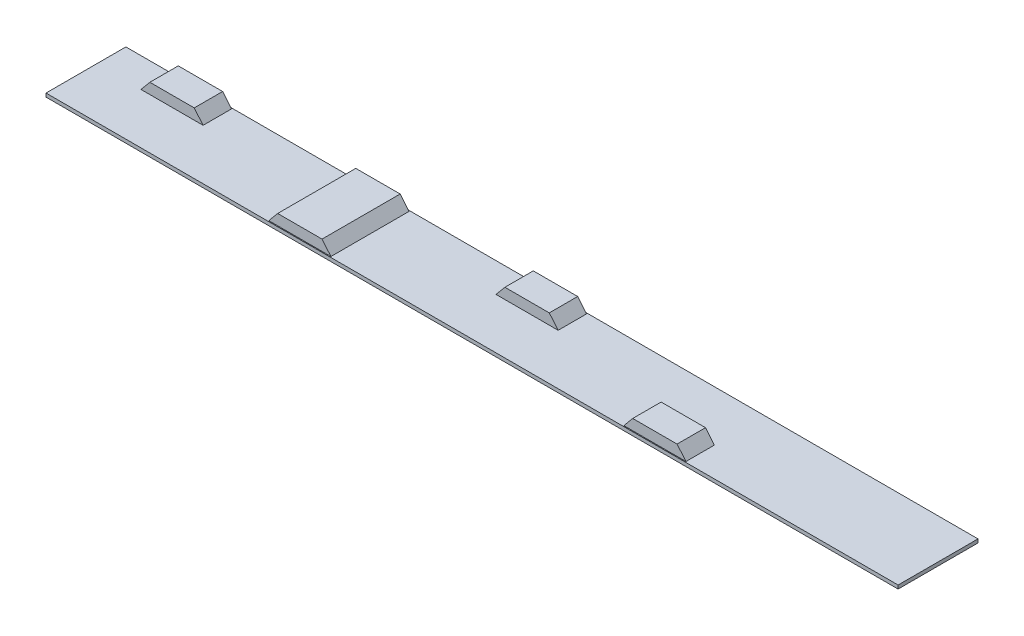
ISO-10303-21;
HEADER;
FILE_DESCRIPTION(('STEP AP214'),'2;1');
FILE_NAME('part.step','',(''),(''),'','','');
FILE_SCHEMA(('AUTOMOTIVE_DESIGN { 1 0 10303 214 1 1 1 1 }'));
ENDSEC;
DATA;
#1=APPLICATION_CONTEXT('core data for automotive mechanical design processes');
#2=APPLICATION_PROTOCOL_DEFINITION('international standard','automotive_design',2000,#1);
#3=PRODUCT_CONTEXT('',#1,'mechanical');
#4=PRODUCT('Part','Part','',(#3));
#5=PRODUCT_RELATED_PRODUCT_CATEGORY('part','',(#4));
#6=PRODUCT_DEFINITION_FORMATION('','',#4);
#7=PRODUCT_DEFINITION_CONTEXT('part definition',#1,'design');
#8=PRODUCT_DEFINITION('design','',#6,#7);
#9=PRODUCT_DEFINITION_SHAPE('','',#8);
#10=(LENGTH_UNIT() NAMED_UNIT(*) SI_UNIT(.MILLI.,.METRE.));
#11=(NAMED_UNIT(*) PLANE_ANGLE_UNIT() SI_UNIT($,.RADIAN.));
#12=(NAMED_UNIT(*) SI_UNIT($,.STERADIAN.) SOLID_ANGLE_UNIT());
#13=UNCERTAINTY_MEASURE_WITH_UNIT(LENGTH_MEASURE(1.E-05),#10,'distance_accuracy_value','');
#14=(GEOMETRIC_REPRESENTATION_CONTEXT(3) GLOBAL_UNCERTAINTY_ASSIGNED_CONTEXT((#13)) GLOBAL_UNIT_ASSIGNED_CONTEXT((#10,
#11,#12)) REPRESENTATION_CONTEXT('',''));
#15=CARTESIAN_POINT('',(0.,0.,0.));
#16=DIRECTION('',(0.,0.,1.));
#17=DIRECTION('',(1.,0.,0.));
#18=AXIS2_PLACEMENT_3D('',#15,#16,#17);
#19=CARTESIAN_POINT('',(0.,10.,0.));
#20=DIRECTION('',(0.,1.,0.));
#21=DIRECTION('',(0.,0.,1.));
#22=AXIS2_PLACEMENT_3D('',#19,#20,#21);
#23=PLANE('',#22);
#24=DIRECTION('',(0.,0.,1.));
#25=VECTOR('',#24,1.);
#26=CARTESIAN_POINT('',(-1200.,10.,112.5));
#27=LINE('',#26,#25);
#28=CARTESIAN_POINT('',(-1200.,10.,-112.5));
#29=VERTEX_POINT('',#28);
#30=CARTESIAN_POINT('',(-1200.,10.,112.5));
#31=VERTEX_POINT('',#30);
#32=EDGE_CURVE('E301',#29,#31,#27,.T.);
#33=ORIENTED_EDGE('',*,*,#32,.T.);
#34=DIRECTION('',(1.,0.,0.));
#35=VECTOR('',#34,1.);
#36=CARTESIAN_POINT('',(1200.,10.,112.5));
#37=LINE('',#36,#35);
#38=CARTESIAN_POINT('',(1200.,10.,112.5));
#39=VERTEX_POINT('',#38);
#40=EDGE_CURVE('E304',#31,#39,#37,.T.);
#41=ORIENTED_EDGE('',*,*,#40,.T.);
#42=DIRECTION('',(0.,0.,-1.));
#43=VECTOR('',#42,1.);
#44=CARTESIAN_POINT('',(1200.,10.,112.5));
#45=LINE('',#44,#43);
#46=CARTESIAN_POINT('',(1200.,10.,-112.5));
#47=VERTEX_POINT('',#46);
#48=EDGE_CURVE('E307',#39,#47,#45,.T.);
#49=ORIENTED_EDGE('',*,*,#48,.T.);
#50=DIRECTION('',(-1.,0.,0.));
#51=VECTOR('',#50,1.);
#52=CARTESIAN_POINT('',(1200.,10.,-112.5));
#53=LINE('',#52,#51);
#54=EDGE_CURVE('E309',#47,#29,#53,.T.);
#55=ORIENTED_EDGE('',*,*,#54,.T.);
#56=EDGE_LOOP('',(#33,#41,#49,#55));
#57=FACE_BOUND('',#56,.T.);
#58=DIRECTION('',(0.,0.,-1.));
#59=VECTOR('',#58,1.);
#60=CARTESIAN_POINT('',(600.,10.,110.));
#61=LINE('',#60,#59);
#62=CARTESIAN_POINT('',(600.,10.,110.));
#63=VERTEX_POINT('',#62);
#64=CARTESIAN_POINT('',(600.,10.,30.));
#65=VERTEX_POINT('',#64);
#66=EDGE_CURVE('E297',#63,#65,#61,.T.);
#67=ORIENTED_EDGE('',*,*,#66,.F.);
#68=DIRECTION('',(1.,0.,0.));
#69=VECTOR('',#68,1.);
#70=CARTESIAN_POINT('',(600.,10.,110.));
#71=LINE('',#70,#69);
#72=CARTESIAN_POINT('',(425.,10.,110.));
#73=VERTEX_POINT('',#72);
#74=EDGE_CURVE('E271',#73,#63,#71,.T.);
#75=ORIENTED_EDGE('',*,*,#74,.F.);
#76=DIRECTION('',(0.,0.,-1.));
#77=VECTOR('',#76,1.);
#78=CARTESIAN_POINT('',(425.,10.,110.));
#79=LINE('',#78,#77);
#80=CARTESIAN_POINT('',(425.,10.,30.));
#81=VERTEX_POINT('',#80);
#82=EDGE_CURVE('E282',#73,#81,#79,.T.);
#83=ORIENTED_EDGE('',*,*,#82,.T.);
#84=DIRECTION('',(1.,0.,0.));
#85=VECTOR('',#84,1.);
#86=CARTESIAN_POINT('',(600.,10.,30.));
#87=LINE('',#86,#85);
#88=EDGE_CURVE('E265',#81,#65,#87,.T.);
#89=ORIENTED_EDGE('',*,*,#88,.T.);
#90=EDGE_LOOP('',(#67,#75,#83,#89));
#91=FACE_BOUND('',#90,.T.);
#92=DIRECTION('',(0.,0.,1.));
#93=VECTOR('',#92,1.);
#94=CARTESIAN_POINT('',(-75.0000000000001,9.99999999999651,-110.));
#95=LINE('',#94,#93);
#96=CARTESIAN_POINT('',(-74.9999999999972,10.,-110.));
#97=VERTEX_POINT('',#96);
#98=CARTESIAN_POINT('',(-75.0000000000001,10.,-30.));
#99=VERTEX_POINT('',#98);
#100=EDGE_CURVE('E262',#97,#99,#95,.T.);
#101=ORIENTED_EDGE('',*,*,#100,.F.);
#102=DIRECTION('',(1.,0.,0.));
#103=VECTOR('',#102,1.);
#104=CARTESIAN_POINT('',(-75.0000000000001,9.99999999999651,-110.));
#105=LINE('',#104,#103);
#106=CARTESIAN_POINT('',(99.999999999997,10.,-110.));
#107=VERTEX_POINT('',#106);
#108=EDGE_CURVE('E239',#97,#107,#105,.T.);
#109=ORIENTED_EDGE('',*,*,#108,.T.);
#110=DIRECTION('',(0.,0.,1.));
#111=VECTOR('',#110,1.);
#112=CARTESIAN_POINT('',(99.9999999999999,9.99999999999651,-110.));
#113=LINE('',#112,#111);
#114=CARTESIAN_POINT('',(99.9999999999999,9.99999999999651,-30.));
#115=VERTEX_POINT('',#114);
#116=EDGE_CURVE('E251',#107,#115,#113,.T.);
#117=ORIENTED_EDGE('',*,*,#116,.T.);
#118=DIRECTION('',(1.,0.,0.));
#119=VECTOR('',#118,1.);
#120=CARTESIAN_POINT('',(-75.0000000000001,9.99999999999651,-30.));
#121=LINE('',#120,#119);
#122=EDGE_CURVE('E233',#99,#115,#121,.T.);
#123=ORIENTED_EDGE('',*,*,#122,.F.);
#124=EDGE_LOOP('',(#101,#109,#117,#123));
#125=FACE_BOUND('',#124,.T.);
#126=DIRECTION('',(0.,0.,1.));
#127=VECTOR('',#126,1.);
#128=CARTESIAN_POINT('',(-575.,9.99999999999302,-110.));
#129=LINE('',#128,#127);
#130=CARTESIAN_POINT('',(-574.999999999994,10.,-110.));
#131=VERTEX_POINT('',#130);
#132=CARTESIAN_POINT('',(-575.,10.,110.));
#133=VERTEX_POINT('',#132);
#134=EDGE_CURVE('E230',#131,#133,#129,.T.);
#135=ORIENTED_EDGE('',*,*,#134,.F.);
#136=DIRECTION('',(1.,0.,0.));
#137=VECTOR('',#136,1.);
#138=CARTESIAN_POINT('',(-575.,9.99999999999302,-110.));
#139=LINE('',#138,#137);
#140=CARTESIAN_POINT('',(-400.000000000006,10.,-110.));
#141=VERTEX_POINT('',#140);
#142=EDGE_CURVE('E218',#131,#141,#139,.T.);
#143=ORIENTED_EDGE('',*,*,#142,.T.);
#144=DIRECTION('',(0.,0.,1.));
#145=VECTOR('',#144,1.);
#146=CARTESIAN_POINT('',(-400.,9.99999999999302,-110.));
#147=LINE('',#146,#145);
#148=CARTESIAN_POINT('',(-400.,9.99999999999302,110.));
#149=VERTEX_POINT('',#148);
#150=EDGE_CURVE('E229',#141,#149,#147,.T.);
#151=ORIENTED_EDGE('',*,*,#150,.T.);
#152=DIRECTION('',(1.,0.,0.));
#153=VECTOR('',#152,1.);
#154=CARTESIAN_POINT('',(-575.,9.99999999999302,110.));
#155=LINE('',#154,#153);
#156=EDGE_CURVE('E203',#133,#149,#155,.T.);
#157=ORIENTED_EDGE('',*,*,#156,.F.);
#158=EDGE_LOOP('',(#135,#143,#151,#157));
#159=FACE_BOUND('',#158,.T.);
#160=DIRECTION('',(0.,0.,1.));
#161=VECTOR('',#160,1.);
#162=CARTESIAN_POINT('',(-1075.,9.99999999998953,-110.));
#163=LINE('',#162,#161);
#164=CARTESIAN_POINT('',(-1074.99999999999,10.,-110.));
#165=VERTEX_POINT('',#164);
#166=CARTESIAN_POINT('',(-1074.99999999999,9.99999999999998,-30.));
#167=VERTEX_POINT('',#166);
#168=EDGE_CURVE('E53',#165,#167,#163,.T.);
#169=ORIENTED_EDGE('',*,*,#168,.F.);
#170=DIRECTION('',(1.,0.,0.));
#171=VECTOR('',#170,1.);
#172=CARTESIAN_POINT('',(-1075.,9.99999999998953,-110.));
#173=LINE('',#172,#171);
#174=CARTESIAN_POINT('',(-900.000000000009,10.,-110.));
#175=VERTEX_POINT('',#174);
#176=EDGE_CURVE('E48',#165,#175,#173,.T.);
#177=ORIENTED_EDGE('',*,*,#176,.T.);
#178=DIRECTION('',(0.,0.,1.));
#179=VECTOR('',#178,1.);
#180=CARTESIAN_POINT('',(-900.,9.99999999998952,-110.));
#181=LINE('',#180,#179);
#182=CARTESIAN_POINT('',(-900.,9.99999999998952,-30.));
#183=VERTEX_POINT('',#182);
#184=EDGE_CURVE('E204',#175,#183,#181,.T.);
#185=ORIENTED_EDGE('',*,*,#184,.T.);
#186=DIRECTION('',(1.,0.,0.));
#187=VECTOR('',#186,1.);
#188=CARTESIAN_POINT('',(-1075.,9.99999999998953,-30.));
#189=LINE('',#188,#187);
#190=EDGE_CURVE('E192',#167,#183,#189,.T.);
#191=ORIENTED_EDGE('',*,*,#190,.F.);
#192=EDGE_LOOP('',(#169,#177,#185,#191));
#193=FACE_BOUND('',#192,.T.);
#194=ADVANCED_FACE('F33',(#57,#91,#125,#159,#193),#23,.T.);
#195=CARTESIAN_POINT('',(-1200.,10.,112.5));
#196=DIRECTION('',(1.,0.,0.));
#197=DIRECTION('',(0.,0.,-1.));
#198=AXIS2_PLACEMENT_3D('',#195,#196,#197);
#199=PLANE('',#198);
#200=DIRECTION('',(0.,0.,1.));
#201=VECTOR('',#200,1.);
#202=CARTESIAN_POINT('',(-1200.,0.,112.5));
#203=LINE('',#202,#201);
#204=CARTESIAN_POINT('',(-1200.,0.,-112.5));
#205=VERTEX_POINT('',#204);
#206=CARTESIAN_POINT('',(-1200.,0.,112.5));
#207=VERTEX_POINT('',#206);
#208=EDGE_CURVE('E300',#205,#207,#203,.T.);
#209=ORIENTED_EDGE('',*,*,#208,.T.);
#210=DIRECTION('',(0.,-1.,0.));
#211=VECTOR('',#210,1.);
#212=CARTESIAN_POINT('',(-1200.,10.,112.5));
#213=LINE('',#212,#211);
#214=EDGE_CURVE('E11',#31,#207,#213,.T.);
#215=ORIENTED_EDGE('',*,*,#214,.F.);
#216=ORIENTED_EDGE('',*,*,#32,.F.);
#217=DIRECTION('',(0.,-1.,0.));
#218=VECTOR('',#217,1.);
#219=CARTESIAN_POINT('',(-1200.,10.,-112.5));
#220=LINE('',#219,#218);
#221=EDGE_CURVE('E311',#29,#205,#220,.T.);
#222=ORIENTED_EDGE('',*,*,#221,.T.);
#223=EDGE_LOOP('',(#209,#215,#216,#222));
#224=FACE_BOUND('',#223,.T.);
#225=ADVANCED_FACE('F35',(#224),#199,.F.);
#226=CARTESIAN_POINT('',(1200.,10.,112.5));
#227=DIRECTION('',(0.,0.,-1.));
#228=DIRECTION('',(-1.,0.,0.));
#229=AXIS2_PLACEMENT_3D('',#226,#227,#228);
#230=PLANE('',#229);
#231=DIRECTION('',(1.,0.,0.));
#232=VECTOR('',#231,1.);
#233=CARTESIAN_POINT('',(1200.,0.,112.5));
#234=LINE('',#233,#232);
#235=CARTESIAN_POINT('',(1200.,0.,112.5));
#236=VERTEX_POINT('',#235);
#237=EDGE_CURVE('E314',#207,#236,#234,.T.);
#238=ORIENTED_EDGE('',*,*,#237,.T.);
#239=DIRECTION('',(0.,-1.,0.));
#240=VECTOR('',#239,1.);
#241=CARTESIAN_POINT('',(1200.,10.,112.5));
#242=LINE('',#241,#240);
#243=EDGE_CURVE('E41',#39,#236,#242,.T.);
#244=ORIENTED_EDGE('',*,*,#243,.F.);
#245=ORIENTED_EDGE('',*,*,#40,.F.);
#246=ORIENTED_EDGE('',*,*,#214,.T.);
#247=EDGE_LOOP('',(#238,#244,#245,#246));
#248=FACE_BOUND('',#247,.T.);
#249=ADVANCED_FACE('F344',(#248),#230,.F.);
#250=CARTESIAN_POINT('',(1200.,10.,112.5));
#251=DIRECTION('',(-1.,0.,0.));
#252=DIRECTION('',(0.,0.,1.));
#253=AXIS2_PLACEMENT_3D('',#250,#251,#252);
#254=PLANE('',#253);
#255=DIRECTION('',(0.,0.,-1.));
#256=VECTOR('',#255,1.);
#257=CARTESIAN_POINT('',(1200.,0.,112.5));
#258=LINE('',#257,#256);
#259=CARTESIAN_POINT('',(1200.,0.,-112.5));
#260=VERTEX_POINT('',#259);
#261=EDGE_CURVE('E316',#236,#260,#258,.T.);
#262=ORIENTED_EDGE('',*,*,#261,.T.);
#263=DIRECTION('',(0.,-1.,0.));
#264=VECTOR('',#263,1.);
#265=CARTESIAN_POINT('',(1200.,10.,-112.5));
#266=LINE('',#265,#264);
#267=EDGE_CURVE('E321',#47,#260,#266,.T.);
#268=ORIENTED_EDGE('',*,*,#267,.F.);
#269=ORIENTED_EDGE('',*,*,#48,.F.);
#270=ORIENTED_EDGE('',*,*,#243,.T.);
#271=EDGE_LOOP('',(#262,#268,#269,#270));
#272=FACE_BOUND('',#271,.T.);
#273=ADVANCED_FACE('F328',(#272),#254,.F.);
#274=CARTESIAN_POINT('',(1200.,10.,-112.5));
#275=DIRECTION('',(0.,0.,1.));
#276=DIRECTION('',(1.,0.,0.));
#277=AXIS2_PLACEMENT_3D('',#274,#275,#276);
#278=PLANE('',#277);
#279=DIRECTION('',(-1.,0.,0.));
#280=VECTOR('',#279,1.);
#281=CARTESIAN_POINT('',(1200.,0.,-112.5));
#282=LINE('',#281,#280);
#283=EDGE_CURVE('E305',#260,#205,#282,.T.);
#284=ORIENTED_EDGE('',*,*,#283,.T.);
#285=ORIENTED_EDGE('',*,*,#221,.F.);
#286=ORIENTED_EDGE('',*,*,#54,.F.);
#287=ORIENTED_EDGE('',*,*,#267,.T.);
#288=EDGE_LOOP('',(#284,#285,#286,#287));
#289=FACE_BOUND('',#288,.T.);
#290=ADVANCED_FACE('F337',(#289),#278,.F.);
#291=CARTESIAN_POINT('',(0.,0.,0.));
#292=DIRECTION('',(0.,1.,0.));
#293=DIRECTION('',(0.,0.,1.));
#294=AXIS2_PLACEMENT_3D('',#291,#292,#293);
#295=PLANE('',#294);
#296=ORIENTED_EDGE('',*,*,#208,.F.);
#297=ORIENTED_EDGE('',*,*,#283,.F.);
#298=ORIENTED_EDGE('',*,*,#261,.F.);
#299=ORIENTED_EDGE('',*,*,#237,.F.);
#300=EDGE_LOOP('',(#296,#297,#298,#299));
#301=FACE_BOUND('',#300,.T.);
#302=ADVANCED_FACE('F334',(#301),#295,.F.);
#303=CARTESIAN_POINT('',(575.,40.,110.));
#304=DIRECTION('',(-0.768221279597376,-0.64018439966448,0.));
#305=DIRECTION('',(0.64018439966448,-0.768221279597376,0.));
#306=AXIS2_PLACEMENT_3D('',#303,#304,#305);
#307=PLANE('',#306);
#308=DIRECTION('',(-0.64018439966448,0.768221279597376,0.));
#309=VECTOR('',#308,1.);
#310=CARTESIAN_POINT('',(575.,40.,30.));
#311=LINE('',#310,#309);
#312=CARTESIAN_POINT('',(575.,40.,30.));
#313=VERTEX_POINT('',#312);
#314=EDGE_CURVE('E284',#65,#313,#311,.T.);
#315=ORIENTED_EDGE('',*,*,#314,.T.);
#316=DIRECTION('',(0.,0.,-1.));
#317=VECTOR('',#316,1.);
#318=CARTESIAN_POINT('',(575.,40.,110.));
#319=LINE('',#318,#317);
#320=CARTESIAN_POINT('',(575.,40.,110.));
#321=VERTEX_POINT('',#320);
#322=EDGE_CURVE('E294',#321,#313,#319,.T.);
#323=ORIENTED_EDGE('',*,*,#322,.F.);
#324=DIRECTION('',(-0.64018439966448,0.768221279597376,0.));
#325=VECTOR('',#324,1.);
#326=CARTESIAN_POINT('',(575.,40.,110.));
#327=LINE('',#326,#325);
#328=EDGE_CURVE('E274',#63,#321,#327,.T.);
#329=ORIENTED_EDGE('',*,*,#328,.F.);
#330=ORIENTED_EDGE('',*,*,#66,.T.);
#331=EDGE_LOOP('',(#315,#323,#329,#330));
#332=FACE_BOUND('',#331,.T.);
#333=ADVANCED_FACE('F357',(#332),#307,.F.);
#334=CARTESIAN_POINT('',(450.,40.,110.));
#335=DIRECTION('',(0.,-1.,0.));
#336=DIRECTION('',(1.,0.,0.));
#337=AXIS2_PLACEMENT_3D('',#334,#335,#336);
#338=PLANE('',#337);
#339=DIRECTION('',(-1.,0.,0.));
#340=VECTOR('',#339,1.);
#341=CARTESIAN_POINT('',(450.,40.,30.));
#342=LINE('',#341,#340);
#343=CARTESIAN_POINT('',(450.,40.,30.));
#344=VERTEX_POINT('',#343);
#345=EDGE_CURVE('E286',#313,#344,#342,.T.);
#346=ORIENTED_EDGE('',*,*,#345,.T.);
#347=DIRECTION('',(0.,0.,-1.));
#348=VECTOR('',#347,1.);
#349=CARTESIAN_POINT('',(450.,40.,110.));
#350=LINE('',#349,#348);
#351=CARTESIAN_POINT('',(450.,40.,110.));
#352=VERTEX_POINT('',#351);
#353=EDGE_CURVE('E291',#352,#344,#350,.T.);
#354=ORIENTED_EDGE('',*,*,#353,.F.);
#355=DIRECTION('',(-1.,0.,0.));
#356=VECTOR('',#355,1.);
#357=CARTESIAN_POINT('',(450.,40.,110.));
#358=LINE('',#357,#356);
#359=EDGE_CURVE('E277',#321,#352,#358,.T.);
#360=ORIENTED_EDGE('',*,*,#359,.F.);
#361=ORIENTED_EDGE('',*,*,#322,.T.);
#362=EDGE_LOOP('',(#346,#354,#360,#361));
#363=FACE_BOUND('',#362,.T.);
#364=ADVANCED_FACE('F376',(#363),#338,.F.);
#365=CARTESIAN_POINT('',(425.,10.,110.));
#366=DIRECTION('',(0.768221279597376,-0.64018439966448,0.));
#367=DIRECTION('',(0.64018439966448,0.768221279597376,0.));
#368=AXIS2_PLACEMENT_3D('',#365,#366,#367);
#369=PLANE('',#368);
#370=DIRECTION('',(-0.64018439966448,-0.768221279597375,0.));
#371=VECTOR('',#370,1.);
#372=CARTESIAN_POINT('',(425.,10.,30.));
#373=LINE('',#372,#371);
#374=EDGE_CURVE('E275',#344,#81,#373,.T.);
#375=ORIENTED_EDGE('',*,*,#374,.T.);
#376=ORIENTED_EDGE('',*,*,#82,.F.);
#377=DIRECTION('',(-0.64018439966448,-0.768221279597375,0.));
#378=VECTOR('',#377,1.);
#379=CARTESIAN_POINT('',(425.,10.,110.));
#380=LINE('',#379,#378);
#381=EDGE_CURVE('E279',#352,#73,#380,.T.);
#382=ORIENTED_EDGE('',*,*,#381,.F.);
#383=ORIENTED_EDGE('',*,*,#353,.T.);
#384=EDGE_LOOP('',(#375,#376,#382,#383));
#385=FACE_BOUND('',#384,.T.);
#386=ADVANCED_FACE('F383',(#385),#369,.F.);
#387=CARTESIAN_POINT('',(0.,0.,110.));
#388=DIRECTION('',(0.,0.,-1.));
#389=DIRECTION('',(-1.,0.,0.));
#390=AXIS2_PLACEMENT_3D('',#387,#388,#389);
#391=PLANE('',#390);
#392=ORIENTED_EDGE('',*,*,#74,.T.);
#393=ORIENTED_EDGE('',*,*,#328,.T.);
#394=ORIENTED_EDGE('',*,*,#359,.T.);
#395=ORIENTED_EDGE('',*,*,#381,.T.);
#396=EDGE_LOOP('',(#392,#393,#394,#395));
#397=FACE_BOUND('',#396,.T.);
#398=ADVANCED_FACE('F390',(#397),#391,.F.);
#399=CARTESIAN_POINT('',(0.,0.,30.));
#400=DIRECTION('',(0.,0.,-1.));
#401=DIRECTION('',(-1.,0.,0.));
#402=AXIS2_PLACEMENT_3D('',#399,#400,#401);
#403=PLANE('',#402);
#404=ORIENTED_EDGE('',*,*,#88,.F.);
#405=ORIENTED_EDGE('',*,*,#374,.F.);
#406=ORIENTED_EDGE('',*,*,#345,.F.);
#407=ORIENTED_EDGE('',*,*,#314,.F.);
#408=EDGE_LOOP('',(#404,#405,#406,#407));
#409=FACE_BOUND('',#408,.T.);
#410=ADVANCED_FACE('F398',(#409),#403,.T.);
#411=CARTESIAN_POINT('',(-50.0000000000001,39.9999999999965,-110.));
#412=DIRECTION('',(-0.768221279597376,0.64018439966448,0.));
#413=DIRECTION('',(-0.64018439966448,-0.768221279597376,0.));
#414=AXIS2_PLACEMENT_3D('',#411,#412,#413);
#415=PLANE('',#414);
#416=DIRECTION('',(-0.64018439966448,-0.768221279597376,0.));
#417=VECTOR('',#416,1.);
#418=CARTESIAN_POINT('',(-50.0000000000001,39.9999999999965,-30.));
#419=LINE('',#418,#417);
#420=CARTESIAN_POINT('',(-50.0000000000001,39.9999999999965,-30.));
#421=VERTEX_POINT('',#420);
#422=EDGE_CURVE('E242',#421,#99,#419,.T.);
#423=ORIENTED_EDGE('',*,*,#422,.F.);
#424=DIRECTION('',(0.,0.,1.));
#425=VECTOR('',#424,1.);
#426=CARTESIAN_POINT('',(-50.0000000000001,39.9999999999965,-110.));
#427=LINE('',#426,#425);
#428=CARTESIAN_POINT('',(-50.0000000000001,39.9999999999965,-110.));
#429=VERTEX_POINT('',#428);
#430=EDGE_CURVE('E266',#429,#421,#427,.T.);
#431=ORIENTED_EDGE('',*,*,#430,.F.);
#432=DIRECTION('',(-0.64018439966448,-0.768221279597376,0.));
#433=VECTOR('',#432,1.);
#434=CARTESIAN_POINT('',(-50.0000000000001,39.9999999999965,-110.));
#435=LINE('',#434,#433);
#436=EDGE_CURVE('E248',#429,#97,#435,.T.);
#437=ORIENTED_EDGE('',*,*,#436,.T.);
#438=ORIENTED_EDGE('',*,*,#100,.T.);
#439=EDGE_LOOP('',(#423,#431,#437,#438));
#440=FACE_BOUND('',#439,.T.);
#441=ADVANCED_FACE('F406',(#440),#415,.T.);
#442=CARTESIAN_POINT('',(74.9999999999998,39.9999999999965,-110.));
#443=DIRECTION('',(0.,1.,0.));
#444=DIRECTION('',(-1.,0.,0.));
#445=AXIS2_PLACEMENT_3D('',#442,#443,#444);
#446=PLANE('',#445);
#447=DIRECTION('',(-1.,0.,0.));
#448=VECTOR('',#447,1.);
#449=CARTESIAN_POINT('',(74.9999999999998,39.9999999999965,-30.));
#450=LINE('',#449,#448);
#451=CARTESIAN_POINT('',(74.9999999999998,39.9999999999965,-30.));
#452=VERTEX_POINT('',#451);
#453=EDGE_CURVE('E257',#452,#421,#450,.T.);
#454=ORIENTED_EDGE('',*,*,#453,.F.);
#455=DIRECTION('',(0.,0.,1.));
#456=VECTOR('',#455,1.);
#457=CARTESIAN_POINT('',(74.9999999999998,39.9999999999965,-110.));
#458=LINE('',#457,#456);
#459=CARTESIAN_POINT('',(74.9999999999998,39.9999999999965,-110.));
#460=VERTEX_POINT('',#459);
#461=EDGE_CURVE('E268',#460,#452,#458,.T.);
#462=ORIENTED_EDGE('',*,*,#461,.F.);
#463=DIRECTION('',(-1.,0.,0.));
#464=VECTOR('',#463,1.);
#465=CARTESIAN_POINT('',(74.9999999999998,39.9999999999965,-110.));
#466=LINE('',#465,#464);
#467=EDGE_CURVE('E245',#460,#429,#466,.T.);
#468=ORIENTED_EDGE('',*,*,#467,.T.);
#469=ORIENTED_EDGE('',*,*,#430,.T.);
#470=EDGE_LOOP('',(#454,#462,#468,#469));
#471=FACE_BOUND('',#470,.T.);
#472=ADVANCED_FACE('F414',(#471),#446,.T.);
#473=CARTESIAN_POINT('',(99.9999999999999,9.99999999999651,-110.));
#474=DIRECTION('',(0.768221279597376,0.64018439966448,0.));
#475=DIRECTION('',(-0.64018439966448,0.768221279597376,0.));
#476=AXIS2_PLACEMENT_3D('',#473,#474,#475);
#477=PLANE('',#476);
#478=DIRECTION('',(-0.64018439966448,0.768221279597376,0.));
#479=VECTOR('',#478,1.);
#480=CARTESIAN_POINT('',(99.9999999999999,9.99999999999651,-30.));
#481=LINE('',#480,#479);
#482=EDGE_CURVE('E254',#115,#452,#481,.T.);
#483=ORIENTED_EDGE('',*,*,#482,.F.);
#484=ORIENTED_EDGE('',*,*,#116,.F.);
#485=DIRECTION('',(-0.64018439966448,0.768221279597376,0.));
#486=VECTOR('',#485,1.);
#487=CARTESIAN_POINT('',(99.9999999999999,9.99999999999651,-110.));
#488=LINE('',#487,#486);
#489=EDGE_CURVE('E241',#107,#460,#488,.T.);
#490=ORIENTED_EDGE('',*,*,#489,.T.);
#491=ORIENTED_EDGE('',*,*,#461,.T.);
#492=EDGE_LOOP('',(#483,#484,#490,#491));
#493=FACE_BOUND('',#492,.T.);
#494=ADVANCED_FACE('F422',(#493),#477,.T.);
#495=CARTESIAN_POINT('',(0.,0.,-110.));
#496=DIRECTION('',(0.,0.,1.));
#497=DIRECTION('',(1.,0.,0.));
#498=AXIS2_PLACEMENT_3D('',#495,#496,#497);
#499=PLANE('',#498);
#500=ORIENTED_EDGE('',*,*,#108,.F.);
#501=ORIENTED_EDGE('',*,*,#436,.F.);
#502=ORIENTED_EDGE('',*,*,#467,.F.);
#503=ORIENTED_EDGE('',*,*,#489,.F.);
#504=EDGE_LOOP('',(#500,#501,#502,#503));
#505=FACE_BOUND('',#504,.T.);
#506=ADVANCED_FACE('F430',(#505),#499,.F.);
#507=CARTESIAN_POINT('',(0.,0.,-30.));
#508=DIRECTION('',(0.,0.,1.));
#509=DIRECTION('',(1.,0.,0.));
#510=AXIS2_PLACEMENT_3D('',#507,#508,#509);
#511=PLANE('',#510);
#512=ORIENTED_EDGE('',*,*,#122,.T.);
#513=ORIENTED_EDGE('',*,*,#482,.T.);
#514=ORIENTED_EDGE('',*,*,#453,.T.);
#515=ORIENTED_EDGE('',*,*,#422,.T.);
#516=EDGE_LOOP('',(#512,#513,#514,#515));
#517=FACE_BOUND('',#516,.T.);
#518=ADVANCED_FACE('F438',(#517),#511,.T.);
#519=CARTESIAN_POINT('',(-550.,39.999999999993,-110.));
#520=DIRECTION('',(-0.768221279597374,0.640184399664482,0.));
#521=DIRECTION('',(-0.640184399664482,-0.768221279597374,0.));
#522=AXIS2_PLACEMENT_3D('',#519,#520,#521);
#523=PLANE('',#522);
#524=ORIENTED_EDGE('',*,*,#134,.T.);
#525=DIRECTION('',(-0.640184399664482,-0.768221279597374,0.));
#526=VECTOR('',#525,1.);
#527=CARTESIAN_POINT('',(-550.,39.999999999993,110.));
#528=LINE('',#527,#526);
#529=CARTESIAN_POINT('',(-550.,39.999999999993,110.));
#530=VERTEX_POINT('',#529);
#531=EDGE_CURVE('E215',#530,#133,#528,.T.);
#532=ORIENTED_EDGE('',*,*,#531,.F.);
#533=DIRECTION('',(0.,0.,1.));
#534=VECTOR('',#533,1.);
#535=CARTESIAN_POINT('',(-550.,39.999999999993,-110.));
#536=LINE('',#535,#534);
#537=CARTESIAN_POINT('',(-550.,39.999999999993,-110.));
#538=VERTEX_POINT('',#537);
#539=EDGE_CURVE('E234',#538,#530,#536,.T.);
#540=ORIENTED_EDGE('',*,*,#539,.F.);
#541=DIRECTION('',(-0.640184399664482,-0.768221279597374,0.));
#542=VECTOR('',#541,1.);
#543=CARTESIAN_POINT('',(-550.,39.999999999993,-110.));
#544=LINE('',#543,#542);
#545=EDGE_CURVE('E226',#538,#131,#544,.T.);
#546=ORIENTED_EDGE('',*,*,#545,.T.);
#547=EDGE_LOOP('',(#524,#532,#540,#546));
#548=FACE_BOUND('',#547,.T.);
#549=ADVANCED_FACE('F446',(#548),#523,.T.);
#550=CARTESIAN_POINT('',(-425.,39.999999999993,-110.));
#551=DIRECTION('',(0.,1.,0.));
#552=DIRECTION('',(-1.,0.,0.));
#553=AXIS2_PLACEMENT_3D('',#550,#551,#552);
#554=PLANE('',#553);
#555=ORIENTED_EDGE('',*,*,#539,.T.);
#556=DIRECTION('',(-1.,0.,0.));
#557=VECTOR('',#556,1.);
#558=CARTESIAN_POINT('',(-425.,39.999999999993,110.));
#559=LINE('',#558,#557);
#560=CARTESIAN_POINT('',(-425.,39.999999999993,110.));
#561=VERTEX_POINT('',#560);
#562=EDGE_CURVE('E212',#561,#530,#559,.T.);
#563=ORIENTED_EDGE('',*,*,#562,.F.);
#564=DIRECTION('',(0.,0.,1.));
#565=VECTOR('',#564,1.);
#566=CARTESIAN_POINT('',(-425.,39.999999999993,-110.));
#567=LINE('',#566,#565);
#568=CARTESIAN_POINT('',(-425.,39.999999999993,-110.));
#569=VERTEX_POINT('',#568);
#570=EDGE_CURVE('E236',#569,#561,#567,.T.);
#571=ORIENTED_EDGE('',*,*,#570,.F.);
#572=DIRECTION('',(-1.,0.,0.));
#573=VECTOR('',#572,1.);
#574=CARTESIAN_POINT('',(-425.,39.999999999993,-110.));
#575=LINE('',#574,#573);
#576=EDGE_CURVE('E223',#569,#538,#575,.T.);
#577=ORIENTED_EDGE('',*,*,#576,.T.);
#578=EDGE_LOOP('',(#555,#563,#571,#577));
#579=FACE_BOUND('',#578,.T.);
#580=ADVANCED_FACE('F454',(#579),#554,.T.);
#581=CARTESIAN_POINT('',(-400.,9.99999999999302,-110.));
#582=DIRECTION('',(0.768221279597376,0.64018439966448,0.));
#583=DIRECTION('',(-0.64018439966448,0.768221279597376,0.));
#584=AXIS2_PLACEMENT_3D('',#581,#582,#583);
#585=PLANE('',#584);
#586=ORIENTED_EDGE('',*,*,#570,.T.);
#587=DIRECTION('',(-0.64018439966448,0.768221279597376,0.));
#588=VECTOR('',#587,1.);
#589=CARTESIAN_POINT('',(-400.,9.99999999999302,110.));
#590=LINE('',#589,#588);
#591=EDGE_CURVE('E209',#149,#561,#590,.T.);
#592=ORIENTED_EDGE('',*,*,#591,.F.);
#593=ORIENTED_EDGE('',*,*,#150,.F.);
#594=DIRECTION('',(-0.64018439966448,0.768221279597376,0.));
#595=VECTOR('',#594,1.);
#596=CARTESIAN_POINT('',(-400.,9.99999999999302,-110.));
#597=LINE('',#596,#595);
#598=EDGE_CURVE('E220',#141,#569,#597,.T.);
#599=ORIENTED_EDGE('',*,*,#598,.T.);
#600=EDGE_LOOP('',(#586,#592,#593,#599));
#601=FACE_BOUND('',#600,.T.);
#602=ADVANCED_FACE('F462',(#601),#585,.T.);
#603=CARTESIAN_POINT('',(0.,0.,-110.));
#604=DIRECTION('',(0.,0.,1.));
#605=DIRECTION('',(1.,0.,0.));
#606=AXIS2_PLACEMENT_3D('',#603,#604,#605);
#607=PLANE('',#606);
#608=ORIENTED_EDGE('',*,*,#142,.F.);
#609=ORIENTED_EDGE('',*,*,#545,.F.);
#610=ORIENTED_EDGE('',*,*,#576,.F.);
#611=ORIENTED_EDGE('',*,*,#598,.F.);
#612=EDGE_LOOP('',(#608,#609,#610,#611));
#613=FACE_BOUND('',#612,.T.);
#614=ADVANCED_FACE('F470',(#613),#607,.F.);
#615=CARTESIAN_POINT('',(0.,0.,110.));
#616=DIRECTION('',(0.,0.,1.));
#617=DIRECTION('',(1.,0.,0.));
#618=AXIS2_PLACEMENT_3D('',#615,#616,#617);
#619=PLANE('',#618);
#620=ORIENTED_EDGE('',*,*,#156,.T.);
#621=ORIENTED_EDGE('',*,*,#591,.T.);
#622=ORIENTED_EDGE('',*,*,#562,.T.);
#623=ORIENTED_EDGE('',*,*,#531,.T.);
#624=EDGE_LOOP('',(#620,#621,#622,#623));
#625=FACE_BOUND('',#624,.T.);
#626=ADVANCED_FACE('F478',(#625),#619,.T.);
#627=CARTESIAN_POINT('',(-925.,39.9999999999895,-110.));
#628=DIRECTION('',(0.,1.,0.));
#629=DIRECTION('',(-1.,0.,0.));
#630=AXIS2_PLACEMENT_3D('',#627,#628,#629);
#631=PLANE('',#630);
#632=DIRECTION('',(-1.,0.,0.));
#633=VECTOR('',#632,1.);
#634=CARTESIAN_POINT('',(-925.,39.9999999999895,-30.));
#635=LINE('',#634,#633);
#636=CARTESIAN_POINT('',(-925.,39.9999999999895,-30.));
#637=VERTEX_POINT('',#636);
#638=CARTESIAN_POINT('',(-1050.,39.9999999999895,-30.));
#639=VERTEX_POINT('',#638);
#640=EDGE_CURVE('E197',#637,#639,#635,.T.);
#641=ORIENTED_EDGE('',*,*,#640,.F.);
#642=DIRECTION('',(0.,0.,1.));
#643=VECTOR('',#642,1.);
#644=CARTESIAN_POINT('',(-925.,39.9999999999895,-110.));
#645=LINE('',#644,#643);
#646=CARTESIAN_POINT('',(-925.,39.9999999999895,-110.));
#647=VERTEX_POINT('',#646);
#648=EDGE_CURVE('E188',#647,#637,#645,.T.);
#649=ORIENTED_EDGE('',*,*,#648,.F.);
#650=DIRECTION('',(-1.,0.,0.));
#651=VECTOR('',#650,1.);
#652=CARTESIAN_POINT('',(-925.,39.9999999999895,-110.));
#653=LINE('',#652,#651);
#654=CARTESIAN_POINT('',(-1050.,39.9999999999895,-110.));
#655=VERTEX_POINT('',#654);
#656=EDGE_CURVE('E184',#647,#655,#653,.T.);
#657=ORIENTED_EDGE('',*,*,#656,.T.);
#658=DIRECTION('',(0.,0.,1.));
#659=VECTOR('',#658,1.);
#660=CARTESIAN_POINT('',(-1050.,39.9999999999895,-110.));
#661=LINE('',#660,#659);
#662=EDGE_CURVE('E168',#655,#639,#661,.T.);
#663=ORIENTED_EDGE('',*,*,#662,.T.);
#664=EDGE_LOOP('',(#641,#649,#657,#663));
#665=FACE_BOUND('',#664,.T.);
#666=ADVANCED_FACE('F187',(#665),#631,.T.);
#667=CARTESIAN_POINT('',(-900.,9.99999999998952,-110.));
#668=DIRECTION('',(0.768221279597376,0.64018439966448,0.));
#669=DIRECTION('',(-0.64018439966448,0.768221279597376,0.));
#670=AXIS2_PLACEMENT_3D('',#667,#668,#669);
#671=PLANE('',#670);
#672=DIRECTION('',(-0.64018439966448,0.768221279597376,0.));
#673=VECTOR('',#672,1.);
#674=CARTESIAN_POINT('',(-900.,9.99999999998952,-30.));
#675=LINE('',#674,#673);
#676=EDGE_CURVE('E189',#183,#637,#675,.T.);
#677=ORIENTED_EDGE('',*,*,#676,.F.);
#678=ORIENTED_EDGE('',*,*,#184,.F.);
#679=DIRECTION('',(-0.64018439966448,0.768221279597376,0.));
#680=VECTOR('',#679,1.);
#681=CARTESIAN_POINT('',(-900.,9.99999999998952,-110.));
#682=LINE('',#681,#680);
#683=EDGE_CURVE('E178',#175,#647,#682,.T.);
#684=ORIENTED_EDGE('',*,*,#683,.T.);
#685=ORIENTED_EDGE('',*,*,#648,.T.);
#686=EDGE_LOOP('',(#677,#678,#684,#685));
#687=FACE_BOUND('',#686,.T.);
#688=ADVANCED_FACE('F493',(#687),#671,.T.);
#689=CARTESIAN_POINT('',(-1050.,39.9999999999895,-110.));
#690=DIRECTION('',(-0.768221279597374,0.640184399664482,0.));
#691=DIRECTION('',(-0.640184399664482,-0.768221279597374,0.));
#692=AXIS2_PLACEMENT_3D('',#689,#690,#691);
#693=PLANE('',#692);
#694=DIRECTION('',(-0.640184399664482,-0.768221279597374,0.));
#695=VECTOR('',#694,1.);
#696=CARTESIAN_POINT('',(-1050.,39.9999999999895,-30.));
#697=LINE('',#696,#695);
#698=EDGE_CURVE('E173',#639,#167,#697,.T.);
#699=ORIENTED_EDGE('',*,*,#698,.F.);
#700=ORIENTED_EDGE('',*,*,#662,.F.);
#701=DIRECTION('',(-0.640184399664482,-0.768221279597374,0.));
#702=VECTOR('',#701,1.);
#703=CARTESIAN_POINT('',(-1050.,39.9999999999895,-110.));
#704=LINE('',#703,#702);
#705=EDGE_CURVE('E171',#655,#165,#704,.T.);
#706=ORIENTED_EDGE('',*,*,#705,.T.);
#707=ORIENTED_EDGE('',*,*,#168,.T.);
#708=EDGE_LOOP('',(#699,#700,#706,#707));
#709=FACE_BOUND('',#708,.T.);
#710=ADVANCED_FACE('F170',(#709),#693,.T.);
#711=CARTESIAN_POINT('',(0.,0.,-110.));
#712=DIRECTION('',(0.,0.,1.));
#713=DIRECTION('',(1.,0.,0.));
#714=AXIS2_PLACEMENT_3D('',#711,#712,#713);
#715=PLANE('',#714);
#716=ORIENTED_EDGE('',*,*,#656,.F.);
#717=ORIENTED_EDGE('',*,*,#683,.F.);
#718=ORIENTED_EDGE('',*,*,#176,.F.);
#719=ORIENTED_EDGE('',*,*,#705,.F.);
#720=EDGE_LOOP('',(#716,#717,#718,#719));
#721=FACE_BOUND('',#720,.T.);
#722=ADVANCED_FACE('F182',(#721),#715,.F.);
#723=CARTESIAN_POINT('',(0.,0.,-30.));
#724=DIRECTION('',(0.,0.,1.));
#725=DIRECTION('',(1.,0.,0.));
#726=AXIS2_PLACEMENT_3D('',#723,#724,#725);
#727=PLANE('',#726);
#728=ORIENTED_EDGE('',*,*,#640,.T.);
#729=ORIENTED_EDGE('',*,*,#698,.T.);
#730=ORIENTED_EDGE('',*,*,#190,.T.);
#731=ORIENTED_EDGE('',*,*,#676,.T.);
#732=EDGE_LOOP('',(#728,#729,#730,#731));
#733=FACE_BOUND('',#732,.T.);
#734=ADVANCED_FACE('F513',(#733),#727,.T.);
#735=CLOSED_SHELL('',(#194,#225,#249,#273,#290,#302,#333,#364,#386,#398,#410,#441,#472,#494,
#506,#518,#549,#580,#602,#614,#626,#666,#688,#710,#722,#734));
#736=MANIFOLD_SOLID_BREP('B2',#735);
#737=ADVANCED_BREP_SHAPE_REPRESENTATION('',(#18,#736),#14);
#738=SHAPE_DEFINITION_REPRESENTATION(#9,#737);
ENDSEC;
END-ISO-10303-21;
